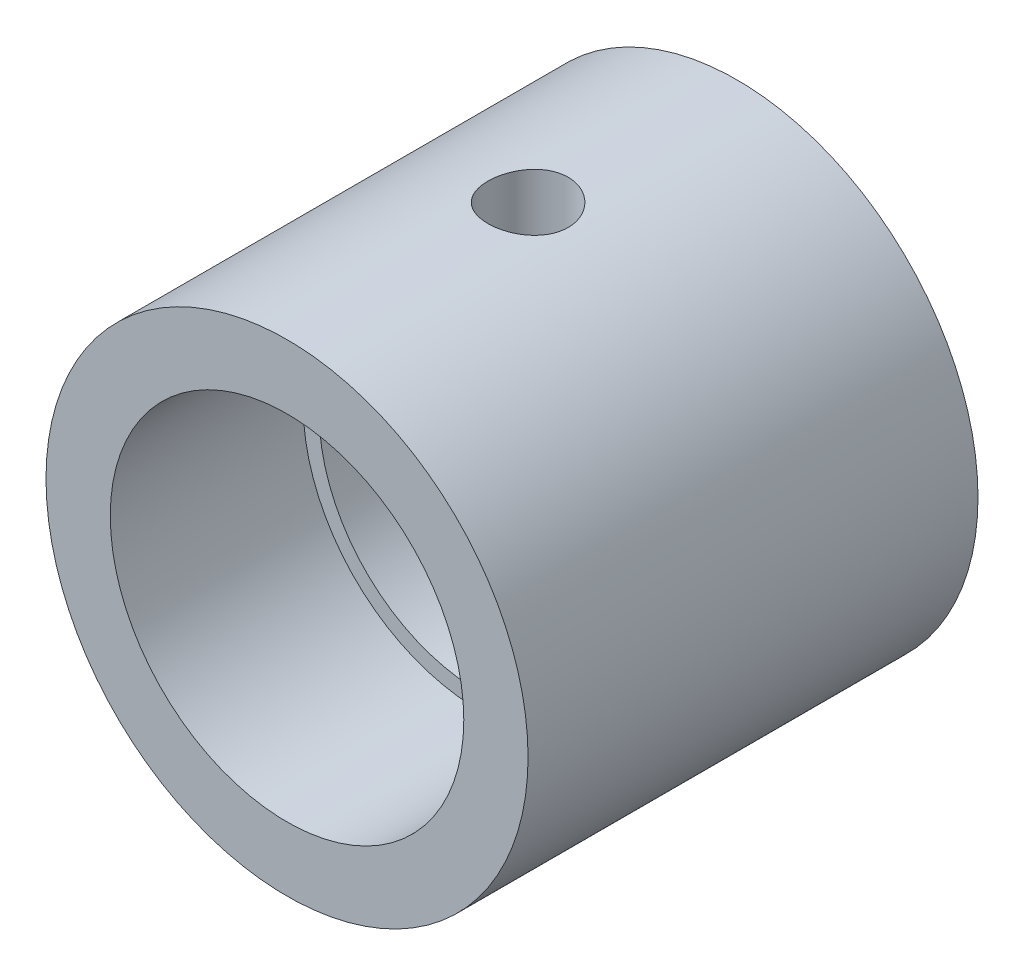
ISO-10303-21;
HEADER;
FILE_DESCRIPTION(('STEP AP214'),'2;1');
FILE_NAME('part.step','',(''),(''),'','','');
FILE_SCHEMA(('AUTOMOTIVE_DESIGN { 1 0 10303 214 1 1 1 1 }'));
ENDSEC;
DATA;
#1=APPLICATION_CONTEXT('core data for automotive mechanical design processes');
#2=APPLICATION_PROTOCOL_DEFINITION('international standard','automotive_design',2000,#1);
#3=PRODUCT_CONTEXT('',#1,'mechanical');
#4=PRODUCT('Part','Part','',(#3));
#5=PRODUCT_RELATED_PRODUCT_CATEGORY('part','',(#4));
#6=PRODUCT_DEFINITION_FORMATION('','',#4);
#7=PRODUCT_DEFINITION_CONTEXT('part definition',#1,'design');
#8=PRODUCT_DEFINITION('design','',#6,#7);
#9=PRODUCT_DEFINITION_SHAPE('','',#8);
#10=(LENGTH_UNIT() NAMED_UNIT(*) SI_UNIT(.MILLI.,.METRE.));
#11=(NAMED_UNIT(*) PLANE_ANGLE_UNIT() SI_UNIT($,.RADIAN.));
#12=(NAMED_UNIT(*) SI_UNIT($,.STERADIAN.) SOLID_ANGLE_UNIT());
#13=UNCERTAINTY_MEASURE_WITH_UNIT(LENGTH_MEASURE(1.E-05),#10,'distance_accuracy_value','');
#14=(GEOMETRIC_REPRESENTATION_CONTEXT(3) GLOBAL_UNCERTAINTY_ASSIGNED_CONTEXT((#13)) GLOBAL_UNIT_ASSIGNED_CONTEXT((#10,
#11,#12)) REPRESENTATION_CONTEXT('',''));
#15=CARTESIAN_POINT('',(0.,0.,0.));
#16=DIRECTION('',(0.,0.,1.));
#17=DIRECTION('',(1.,0.,0.));
#18=AXIS2_PLACEMENT_3D('',#15,#16,#17);
#19=CARTESIAN_POINT('',(0.,0.,27.));
#20=DIRECTION('',(0.,0.,-1.));
#21=DIRECTION('',(-1.,0.,0.));
#22=AXIS2_PLACEMENT_3D('',#19,#20,#21);
#23=CYLINDRICAL_SURFACE('',#22,15.);
#24=CARTESIAN_POINT('',(0.,-15.,14.5));
#25=CARTESIAN_POINT('',(0.139390904958215,-14.9999976116882,14.4999944110522));
#26=CARTESIAN_POINT('',(0.278857881838821,-14.9980367791303,14.4883027250311));
#27=CARTESIAN_POINT('',(0.553880221673043,-14.9904034494139,14.4418643412347));
#28=CARTESIAN_POINT('',(0.689431867959247,-14.9847275392389,14.4070964430884));
#29=CARTESIAN_POINT('',(0.952604747212645,-14.9703006823645,14.3155845514072));
#30=CARTESIAN_POINT('',(1.0802323684319,-14.9615522515919,14.2588585343594));
#31=CARTESIAN_POINT('',(1.32414184197795,-14.9419422708207,14.1250877079476));
#32=CARTESIAN_POINT('',(1.44042498987859,-14.9310809625443,14.048045222517));
#33=CARTESIAN_POINT('',(1.65947261429168,-14.9083331745831,13.8750449161795));
#34=CARTESIAN_POINT('',(1.76211290353497,-14.8964387181486,13.7789308853639));
#35=CARTESIAN_POINT('',(1.94988849865993,-14.8730262687673,13.5708520315272));
#36=CARTESIAN_POINT('',(2.03502269939097,-14.8615082996267,13.4588862085434));
#37=CARTESIAN_POINT('',(2.18586712560514,-14.8400756575978,13.2214290338029));
#38=CARTESIAN_POINT('',(2.251454552861,-14.8301712909164,13.0958586631952));
#39=CARTESIAN_POINT('',(2.36055836541122,-14.8131978979467,12.8352904356994));
#40=CARTESIAN_POINT('',(2.40407624156561,-14.8061286801431,12.7002932163224));
#41=CARTESIAN_POINT('',(2.46741437778481,-14.7957053684276,12.4260197251435));
#42=CARTESIAN_POINT('',(2.4874490291354,-14.792317684857,12.2867942634986));
#43=CARTESIAN_POINT('',(2.50391672528988,-14.7895393893665,12.0069197231165));
#44=CARTESIAN_POINT('',(2.500351440389,-14.7901484945721,11.8662707458327));
#45=CARTESIAN_POINT('',(2.46989509839615,-14.7952642886355,11.5890721387245));
#46=CARTESIAN_POINT('',(2.44324488188977,-14.7997307331892,11.4524951964548));
#47=CARTESIAN_POINT('',(2.36775314040345,-14.8119949521101,11.1857786821709));
#48=CARTESIAN_POINT('',(2.31891085431974,-14.8197928407327,11.0556393311115));
#49=CARTESIAN_POINT('',(2.20017724609391,-14.837884793341,10.8047711765591));
#50=CARTESIAN_POINT('',(2.13018591387971,-14.8481906710733,10.6840905939188));
#51=CARTESIAN_POINT('',(1.97121201755743,-14.8701291841501,10.4560955994616));
#52=CARTESIAN_POINT('',(1.88222792065429,-14.8817619265429,10.3487822675451));
#53=CARTESIAN_POINT('',(1.68648221215905,-14.9052202787979,10.1491739141927));
#54=CARTESIAN_POINT('',(1.57951396387313,-14.9170464923165,10.0570814814599));
#55=CARTESIAN_POINT('',(1.35153524898165,-14.9394260139672,9.89212223733466));
#56=CARTESIAN_POINT('',(1.23052469190642,-14.9499793138975,9.81925554981677));
#57=CARTESIAN_POINT('',(0.977705916166711,-14.9686389289291,9.69479777286372));
#58=CARTESIAN_POINT('',(0.845888725564662,-14.9767431840745,9.64322458066874));
#59=CARTESIAN_POINT('',(0.575298345602731,-14.9895750301266,9.56300578475402));
#60=CARTESIAN_POINT('',(0.436525739179468,-14.9943029035047,9.53435826302628));
#61=CARTESIAN_POINT('',(0.157709901301623,-14.9998112984269,9.50107864153886));
#62=CARTESIAN_POINT('',(0.0177007371510107,-15.0006375301278,9.49616842819439));
#63=CARTESIAN_POINT('',(-0.261139772889888,-14.9983747442117,9.50976134442812));
#64=CARTESIAN_POINT('',(-0.399971163892039,-14.9952858772412,9.52826357313374));
#65=CARTESIAN_POINT('',(-0.671656175546764,-14.985568269382,9.58792484933548));
#66=CARTESIAN_POINT('',(-0.804540868385379,-14.9789610480131,9.62894620839012));
#67=CARTESIAN_POINT('',(-1.06154688486044,-14.9629446445536,9.73233451819953));
#68=CARTESIAN_POINT('',(-1.18566771590972,-14.9535353051202,9.79470266763527));
#69=CARTESIAN_POINT('',(-1.42283068946896,-14.9328451630241,9.93965112469679));
#70=CARTESIAN_POINT('',(-1.53576525093715,-14.9215485588702,10.0224051561673));
#71=CARTESIAN_POINT('',(-1.74624358550269,-14.898384673919,10.2055373153851));
#72=CARTESIAN_POINT('',(-1.84378623969658,-14.8865173517155,10.3059167232767));
#73=CARTESIAN_POINT('',(-2.021742779658,-14.8634017523585,10.5226975480714));
#74=CARTESIAN_POINT('',(-2.10196876111372,-14.8521611613711,10.6392541655144));
#75=CARTESIAN_POINT('',(-2.24170231029499,-14.8317152977788,10.8843529691385));
#76=CARTESIAN_POINT('',(-2.30121053476982,-14.8225099606602,11.0128947752275));
#77=CARTESIAN_POINT('',(-2.39753833147315,-14.807234536977,11.2777897328121));
#78=CARTESIAN_POINT('',(-2.43445143254795,-14.8011515431106,11.4141080950305));
#79=CARTESIAN_POINT('',(-2.48483545377828,-14.7927771683526,11.6911201292218));
#80=CARTESIAN_POINT('',(-2.49830841194617,-14.7904854578272,11.8318134197321));
#81=CARTESIAN_POINT('',(-2.50137286604735,-14.7899673308401,12.1117051659624));
#82=CARTESIAN_POINT('',(-2.49126013612519,-14.7916905650565,12.2509003785753));
#83=CARTESIAN_POINT('',(-2.44807983895685,-14.7988978145373,12.5255792480508));
#84=CARTESIAN_POINT('',(-2.41501234611248,-14.8043818176121,12.6610629169419));
#85=CARTESIAN_POINT('',(-2.3269744895949,-14.8184735628172,12.9243584372926));
#86=CARTESIAN_POINT('',(-2.27202959060044,-14.8270776721967,13.052179010056));
#87=CARTESIAN_POINT('',(-2.14182700391591,-14.8464436892221,13.2968356691948));
#88=CARTESIAN_POINT('',(-2.06656830874856,-14.857205703884,13.4136712103721));
#89=CARTESIAN_POINT('',(-1.89681888437216,-14.8798345404562,13.6345355831078));
#90=CARTESIAN_POINT('',(-1.80211056359365,-14.891712955763,13.7383960167003));
#91=CARTESIAN_POINT('',(-1.59660903138023,-14.9151437236084,13.9288516044749));
#92=CARTESIAN_POINT('',(-1.48581211291264,-14.9266960002655,14.0154427686382));
#93=CARTESIAN_POINT('',(-1.25036916964028,-14.9482652964222,14.1694482681999));
#94=CARTESIAN_POINT('',(-1.12563278753282,-14.958271162531,14.236726039313));
#95=CARTESIAN_POINT('',(-0.866513069378981,-14.9755116760178,14.3492694846099));
#96=CARTESIAN_POINT('',(-0.73213949483001,-14.9827490817748,14.3945570810797));
#97=CARTESIAN_POINT('',(-0.4977033100454,-14.9920579083296,14.4520052741267));
#98=CARTESIAN_POINT('',(-0.399058830298447,-14.9950202727336,14.469974469616));
#99=CARTESIAN_POINT('',(-0.200289310319809,-14.9989921598612,14.4939737378448));
#100=CARTESIAN_POINT('',(-0.100164295608494,-15.0000017162064,14.5000040161374));
#101=CARTESIAN_POINT('',(0.,-15.,14.5));
#102=B_SPLINE_CURVE_WITH_KNOTS('',3,(#24,#25,#26,#27,#28,#29,#30,#31,#32,#33,#34,#35,#36,#37,
#38,#39,#40,#41,#42,#43,#44,#45,#46,#47,#48,#49,#50,#51,#52,#53,#54,#55,#56,#57,#58,#59,#60,#61,
#62,#63,#64,#65,#66,#67,#68,#69,#70,#71,#72,#73,#74,#75,#76,#77,#78,#79,#80,#81,#82,#83,#84,#85,
#86,#87,#88,#89,#90,#91,#92,#93,#94,#95,#96,#97,#98,#99,#100,#101),.UNSPECIFIED.,.T.,.F.,(4,2,2,
2,2,2,2,2,2,2,2,2,2,2,2,2,2,2,2,2,2,2,2,2,2,2,2,2,2,2,2,2,2,2,2,2,2,2,4),(0.,0.41780658493851,
0.835997545695421,1.25384686702527,1.67164841267479,2.09302491062332,2.51442800169857,
2.9384252082384,3.36239376876182,3.78246077103424,4.20249804320887,4.61820521760409,
5.03392665025382,5.45164556632558,5.86939820680574,6.29232769911327,6.71525991635848,
7.13854688915904,7.56179844521149,7.98007883491398,8.3983431303586,8.81407807006416,
9.22983635826067,9.64926825627024,10.0687306305428,10.4925382200762,10.9163323737594,
11.3383602234177,11.7603513778662,12.177079095227,12.5938054618813,13.0100481822622,
13.4263115502934,13.8475138419339,14.2688133387897,14.693022316072,15.1168075213007,
15.4170424816402,15.7172722727697),.UNSPECIFIED.);
#103=CARTESIAN_POINT('',(0.,-15.,14.5));
#104=VERTEX_POINT('',#103);
#105=EDGE_CURVE('E88',#104,#104,#102,.T.);
#106=ORIENTED_EDGE('',*,*,#105,.T.);
#107=EDGE_LOOP('',(#106));
#108=FACE_BOUND('',#107,.T.);
#109=CARTESIAN_POINT('',(0.,15.,14.5));
#110=CARTESIAN_POINT('',(-0.139390904958215,14.9999976116882,14.4999944110522));
#111=CARTESIAN_POINT('',(-0.278857881838821,14.9980367791303,14.4883027250311));
#112=CARTESIAN_POINT('',(-0.553880221673043,14.9904034494139,14.4418643412347));
#113=CARTESIAN_POINT('',(-0.689431867959248,14.9847275392389,14.4070964430884));
#114=CARTESIAN_POINT('',(-0.952604747212645,14.9703006823645,14.3155845514072));
#115=CARTESIAN_POINT('',(-1.0802323684319,14.9615522515919,14.2588585343594));
#116=CARTESIAN_POINT('',(-1.32414184197795,14.9419422708207,14.1250877079476));
#117=CARTESIAN_POINT('',(-1.44042498987859,14.9310809625443,14.048045222517));
#118=CARTESIAN_POINT('',(-1.65947261429168,14.9083331745831,13.8750449161795));
#119=CARTESIAN_POINT('',(-1.76211290353497,14.8964387181486,13.7789308853639));
#120=CARTESIAN_POINT('',(-1.94988849865993,14.8730262687673,13.5708520315272));
#121=CARTESIAN_POINT('',(-2.03502269939097,14.8615082996267,13.4588862085434));
#122=CARTESIAN_POINT('',(-2.18586712560514,14.8400756575978,13.2214290338029));
#123=CARTESIAN_POINT('',(-2.251454552861,14.8301712909164,13.0958586631952));
#124=CARTESIAN_POINT('',(-2.36055836541122,14.8131978979467,12.8352904356994));
#125=CARTESIAN_POINT('',(-2.40407624156561,14.8061286801431,12.7002932163224));
#126=CARTESIAN_POINT('',(-2.46741437778481,14.7957053684276,12.4260197251435));
#127=CARTESIAN_POINT('',(-2.4874490291354,14.792317684857,12.2867942634986));
#128=CARTESIAN_POINT('',(-2.50391672528988,14.7895393893665,12.0069197231165));
#129=CARTESIAN_POINT('',(-2.500351440389,14.7901484945721,11.8662707458327));
#130=CARTESIAN_POINT('',(-2.46989509839615,14.7952642886355,11.5890721387245));
#131=CARTESIAN_POINT('',(-2.44324488188977,14.7997307331892,11.4524951964548));
#132=CARTESIAN_POINT('',(-2.36775314040345,14.8119949521101,11.1857786821709));
#133=CARTESIAN_POINT('',(-2.31891085431974,14.8197928407327,11.0556393311115));
#134=CARTESIAN_POINT('',(-2.20017724609391,14.837884793341,10.8047711765591));
#135=CARTESIAN_POINT('',(-2.13018591387971,14.8481906710733,10.6840905939188));
#136=CARTESIAN_POINT('',(-1.97121201755743,14.8701291841501,10.4560955994616));
#137=CARTESIAN_POINT('',(-1.88222792065429,14.8817619265429,10.3487822675451));
#138=CARTESIAN_POINT('',(-1.68648221215905,14.9052202787979,10.1491739141927));
#139=CARTESIAN_POINT('',(-1.57951396387313,14.9170464923165,10.0570814814599));
#140=CARTESIAN_POINT('',(-1.35153524898165,14.9394260139672,9.89212223733466));
#141=CARTESIAN_POINT('',(-1.23052469190642,14.9499793138975,9.81925554981677));
#142=CARTESIAN_POINT('',(-0.977705916166712,14.9686389289291,9.69479777286372));
#143=CARTESIAN_POINT('',(-0.845888725564662,14.9767431840745,9.64322458066874));
#144=CARTESIAN_POINT('',(-0.575298345602732,14.9895750301266,9.56300578475402));
#145=CARTESIAN_POINT('',(-0.436525739179468,14.9943029035047,9.53435826302628));
#146=CARTESIAN_POINT('',(-0.157709901301623,14.9998112984269,9.50107864153886));
#147=CARTESIAN_POINT('',(-0.0177007371510108,15.0006375301278,9.49616842819439));
#148=CARTESIAN_POINT('',(0.261139772889888,14.9983747442117,9.50976134442812));
#149=CARTESIAN_POINT('',(0.399971163892039,14.9952858772412,9.52826357313374));
#150=CARTESIAN_POINT('',(0.671656175546764,14.985568269382,9.58792484933548));
#151=CARTESIAN_POINT('',(0.80454086838538,14.9789610480131,9.62894620839012));
#152=CARTESIAN_POINT('',(1.06154688486044,14.9629446445536,9.73233451819953));
#153=CARTESIAN_POINT('',(1.18566771590972,14.9535353051202,9.79470266763527));
#154=CARTESIAN_POINT('',(1.42283068946896,14.9328451630241,9.93965112469679));
#155=CARTESIAN_POINT('',(1.53576525093715,14.9215485588702,10.0224051561673));
#156=CARTESIAN_POINT('',(1.74624358550269,14.898384673919,10.2055373153851));
#157=CARTESIAN_POINT('',(1.84378623969658,14.8865173517155,10.3059167232767));
#158=CARTESIAN_POINT('',(2.021742779658,14.8634017523585,10.5226975480714));
#159=CARTESIAN_POINT('',(2.10196876111372,14.8521611613711,10.6392541655144));
#160=CARTESIAN_POINT('',(2.24170231029499,14.8317152977788,10.8843529691385));
#161=CARTESIAN_POINT('',(2.30121053476982,14.8225099606602,11.0128947752275));
#162=CARTESIAN_POINT('',(2.39753833147315,14.807234536977,11.2777897328121));
#163=CARTESIAN_POINT('',(2.43445143254795,14.8011515431106,11.4141080950305));
#164=CARTESIAN_POINT('',(2.48483545377828,14.7927771683526,11.6911201292218));
#165=CARTESIAN_POINT('',(2.49830841194617,14.7904854578272,11.8318134197321));
#166=CARTESIAN_POINT('',(2.50137286604735,14.7899673308401,12.1117051659624));
#167=CARTESIAN_POINT('',(2.49126013612519,14.7916905650565,12.2509003785753));
#168=CARTESIAN_POINT('',(2.44807983895685,14.7988978145373,12.5255792480508));
#169=CARTESIAN_POINT('',(2.41501234611248,14.8043818176121,12.6610629169419));
#170=CARTESIAN_POINT('',(2.3269744895949,14.8184735628172,12.9243584372926));
#171=CARTESIAN_POINT('',(2.27202959060044,14.8270776721967,13.052179010056));
#172=CARTESIAN_POINT('',(2.14182700391591,14.8464436892221,13.2968356691948));
#173=CARTESIAN_POINT('',(2.06656830874856,14.857205703884,13.4136712103721));
#174=CARTESIAN_POINT('',(1.89681888437216,14.8798345404562,13.6345355831078));
#175=CARTESIAN_POINT('',(1.80211056359365,14.891712955763,13.7383960167003));
#176=CARTESIAN_POINT('',(1.59660903138023,14.9151437236084,13.9288516044749));
#177=CARTESIAN_POINT('',(1.48581211291264,14.9266960002655,14.0154427686382));
#178=CARTESIAN_POINT('',(1.25036916964028,14.9482652964222,14.1694482681999));
#179=CARTESIAN_POINT('',(1.12563278753282,14.958271162531,14.236726039313));
#180=CARTESIAN_POINT('',(0.866513069378982,14.9755116760178,14.3492694846099));
#181=CARTESIAN_POINT('',(0.73213949483001,14.9827490817748,14.3945570810797));
#182=CARTESIAN_POINT('',(0.497703310045401,14.9920579083296,14.4520052741267));
#183=CARTESIAN_POINT('',(0.399058830298448,14.9950202727336,14.469974469616));
#184=CARTESIAN_POINT('',(0.200289310319809,14.9989921598612,14.4939737378448));
#185=CARTESIAN_POINT('',(0.100164295608494,15.0000017162064,14.5000040161374));
#186=CARTESIAN_POINT('',(0.,15.,14.5));
#187=B_SPLINE_CURVE_WITH_KNOTS('',3,(#109,#110,#111,#112,#113,#114,#115,#116,#117,#118,#119,
#120,#121,#122,#123,#124,#125,#126,#127,#128,#129,#130,#131,#132,#133,#134,#135,#136,#137,#138,
#139,#140,#141,#142,#143,#144,#145,#146,#147,#148,#149,#150,#151,#152,#153,#154,#155,#156,#157,
#158,#159,#160,#161,#162,#163,#164,#165,#166,#167,#168,#169,#170,#171,#172,#173,#174,#175,#176,
#177,#178,#179,#180,#181,#182,#183,#184,#185,#186),.UNSPECIFIED.,.T.,.F.,(4,2,2,2,2,2,2,2,2,2,2,
2,2,2,2,2,2,2,2,2,2,2,2,2,2,2,2,2,2,2,2,2,2,2,2,2,2,2,4),(0.,0.41780658493851,0.835997545695422,
1.25384686702527,1.67164841267479,2.09302491062332,2.51442800169857,2.9384252082384,
3.36239376876182,3.78246077103424,4.20249804320887,4.61820521760409,5.03392665025382,
5.45164556632558,5.86939820680574,6.29232769911327,6.71525991635848,7.13854688915904,
7.56179844521149,7.98007883491398,8.3983431303586,8.81407807006416,9.22983635826067,
9.64926825627025,10.0687306305428,10.4925382200762,10.9163323737594,11.3383602234177,
11.7603513778662,12.177079095227,12.5938054618813,13.0100481822622,13.4263115502934,
13.8475138419339,14.2688133387897,14.693022316072,15.1168075213007,15.4170424816402,
15.7172722727697),.UNSPECIFIED.);
#188=CARTESIAN_POINT('',(0.,15.,14.5));
#189=VERTEX_POINT('',#188);
#190=EDGE_CURVE('E82',#189,#189,#187,.T.);
#191=ORIENTED_EDGE('',*,*,#190,.T.);
#192=EDGE_LOOP('',(#191));
#193=FACE_BOUND('',#192,.T.);
#194=CARTESIAN_POINT('',(0.,0.,27.));
#195=DIRECTION('',(0.,0.,1.));
#196=DIRECTION('',(1.,0.,0.));
#197=AXIS2_PLACEMENT_3D('',#194,#195,#196);
#198=CIRCLE('',#197,15.);
#199=CARTESIAN_POINT('',(15.,0.,27.));
#200=VERTEX_POINT('',#199);
#201=EDGE_CURVE('E10',#200,#200,#198,.T.);
#202=ORIENTED_EDGE('',*,*,#201,.F.);
#203=EDGE_LOOP('',(#202));
#204=FACE_BOUND('',#203,.T.);
#205=CARTESIAN_POINT('',(0.,0.,-1.));
#206=DIRECTION('',(0.,0.,-1.));
#207=DIRECTION('',(-1.,0.,0.));
#208=AXIS2_PLACEMENT_3D('',#205,#206,#207);
#209=CIRCLE('',#208,15.);
#210=CARTESIAN_POINT('',(-15.,0.,-1.));
#211=VERTEX_POINT('',#210);
#212=EDGE_CURVE('E95',#211,#211,#209,.T.);
#213=ORIENTED_EDGE('',*,*,#212,.F.);
#214=EDGE_LOOP('',(#213));
#215=FACE_BOUND('',#214,.T.);
#216=ADVANCED_FACE('F37',(#108,#193,#204,#215),#23,.T.);
#217=CARTESIAN_POINT('',(0.,0.,27.));
#218=DIRECTION('',(0.,0.,1.));
#219=DIRECTION('',(1.,0.,0.));
#220=AXIS2_PLACEMENT_3D('',#217,#218,#219);
#221=PLANE('',#220);
#222=CARTESIAN_POINT('',(0.,0.,27.));
#223=DIRECTION('',(0.,0.,1.));
#224=DIRECTION('',(1.,0.,0.));
#225=AXIS2_PLACEMENT_3D('',#222,#223,#224);
#226=CIRCLE('',#225,11.);
#227=CARTESIAN_POINT('',(11.,0.,27.));
#228=VERTEX_POINT('',#227);
#229=EDGE_CURVE('E99',#228,#228,#226,.T.);
#230=ORIENTED_EDGE('',*,*,#229,.F.);
#231=EDGE_LOOP('',(#230));
#232=FACE_BOUND('',#231,.T.);
#233=ORIENTED_EDGE('',*,*,#201,.T.);
#234=EDGE_LOOP('',(#233));
#235=FACE_BOUND('',#234,.T.);
#236=ADVANCED_FACE('F123',(#232,#235),#221,.T.);
#237=CARTESIAN_POINT('',(0.,0.,27.));
#238=DIRECTION('',(0.,0.,1.));
#239=DIRECTION('',(1.,0.,0.));
#240=AXIS2_PLACEMENT_3D('',#237,#238,#239);
#241=CYLINDRICAL_SURFACE('',#240,9.99999999999999);
#242=CARTESIAN_POINT('',(0.,-9.99999999999999,14.5));
#243=CARTESIAN_POINT('',(-0.138126814449552,-9.99999766446687,14.4999961237697));
#244=CARTESIAN_POINT('',(-0.276296929717939,-9.99710963553043,14.4885140820437));
#245=CARTESIAN_POINT('',(-0.548677206284221,-9.98586856383157,14.442958081155));
#246=CARTESIAN_POINT('',(-0.682885078117899,-9.97751242366626,14.4088713174369));
#247=CARTESIAN_POINT('',(-0.943368120304295,-9.9562604388672,14.3192679108965));
#248=CARTESIAN_POINT('',(-1.06965260571667,-9.94337004736763,14.2637770021412));
#249=CARTESIAN_POINT('',(-1.31112021984071,-9.91442239679368,14.1330310165919));
#250=CARTESIAN_POINT('',(-1.4263029739146,-9.8983650309026,14.0577752731351));
#251=CARTESIAN_POINT('',(-1.64466987883486,-9.86445689319488,13.8879986839097));
#252=CARTESIAN_POINT('',(-1.74759281676843,-9.84657845246876,13.7931473750682));
#253=CARTESIAN_POINT('',(-1.93624821200553,-9.8112270019656,13.5875796584849));
#254=CARTESIAN_POINT('',(-2.02197872824865,-9.79375403816446,13.4768614617551));
#255=CARTESIAN_POINT('',(-2.17504423799829,-9.7609129283028,13.240674622105));
#256=CARTESIAN_POINT('',(-2.2420870265419,-9.74557990774684,13.1150112819855));
#257=CARTESIAN_POINT('',(-2.35399484758457,-9.71915824696693,12.8537526472333));
#258=CARTESIAN_POINT('',(-2.39886342573357,-9.7080689282403,12.7181589444466));
#259=CARTESIAN_POINT('',(-2.46425806134128,-9.69167461160538,12.4437608363306));
#260=CARTESIAN_POINT('',(-2.48525378055342,-9.68625818328351,12.30507517327));
#261=CARTESIAN_POINT('',(-2.50376962511068,-9.68148937432652,12.0260523850011));
#262=CARTESIAN_POINT('',(-2.50129356969685,-9.68213600713214,11.8857155321798));
#263=CARTESIAN_POINT('',(-2.47331087439951,-9.68932009194694,11.6109736537577));
#264=CARTESIAN_POINT('',(-2.44836390031772,-9.69571438345489,11.4765072975578));
#265=CARTESIAN_POINT('',(-2.37704031150499,-9.71344516118448,11.2137315818149));
#266=CARTESIAN_POINT('',(-2.33066217011566,-9.72478199948731,11.0854226616185));
#267=CARTESIAN_POINT('',(-2.21731579656198,-9.75125189842764,10.8371033062465));
#268=CARTESIAN_POINT('',(-2.1501444453882,-9.76642212449693,10.717189713684));
#269=CARTESIAN_POINT('',(-1.99726046002491,-9.79882851409984,10.4901354837386));
#270=CARTESIAN_POINT('',(-1.91154458134806,-9.81606503891046,10.3829970865546));
#271=CARTESIAN_POINT('',(-1.72110570780204,-9.85126467566485,10.181327307176));
#272=CARTESIAN_POINT('',(-1.61591043027644,-9.86923449130001,10.0872425165644));
#273=CARTESIAN_POINT('',(-1.39101986250617,-9.90343275964593,9.91796459589349));
#274=CARTESIAN_POINT('',(-1.27132412951324,-9.91966115915679,9.84277204289406));
#275=CARTESIAN_POINT('',(-1.02019314780232,-9.9486288682365,9.71324902295936));
#276=CARTESIAN_POINT('',(-0.888718988681039,-9.96135600212878,9.65899109957595));
#277=CARTESIAN_POINT('',(-0.618126680238139,-9.9817986165236,9.57347115715071));
#278=CARTESIAN_POINT('',(-0.479009998584142,-9.98951505565467,9.5422047393031));
#279=CARTESIAN_POINT('',(-0.200899950650047,-9.99892498785624,9.50423739073527));
#280=CARTESIAN_POINT('',(-0.0619945333136854,-10.0007675584713,9.4969282898745));
#281=CARTESIAN_POINT('',(0.215054791335846,-9.99864674690754,9.50541500342581));
#282=CARTESIAN_POINT('',(0.353198766074326,-9.99468388736421,9.52120873799856));
#283=CARTESIAN_POINT('',(0.622690447960817,-9.98149301878918,9.57495151398562));
#284=CARTESIAN_POINT('',(0.754108531614582,-9.97234390309646,9.61256877246162));
#285=CARTESIAN_POINT('',(1.00876215408753,-9.94981177723595,9.7085118067141));
#286=CARTESIAN_POINT('',(1.13199686505442,-9.93642833949964,9.76683967385537));
#287=CARTESIAN_POINT('',(1.36920522404972,-9.9065551321037,9.90372688145779));
#288=CARTESIAN_POINT('',(1.48297573639294,-9.89001445610999,9.98262685399427));
#289=CARTESIAN_POINT('',(1.69587768940552,-9.85574181979586,10.1579831813286));
#290=CARTESIAN_POINT('',(1.79500659828875,-9.83800965421577,10.2544425660294));
#291=CARTESIAN_POINT('',(1.97831761345414,-9.80281594932497,10.4650032680728));
#292=CARTESIAN_POINT('',(2.06207311270184,-9.78537173637463,10.5794795049993));
#293=CARTESIAN_POINT('',(2.20918459835605,-9.75321463970069,10.8212210574476));
#294=CARTESIAN_POINT('',(2.27254149026901,-9.7385016347494,10.9484858049507));
#295=CARTESIAN_POINT('',(2.37658570101223,-9.71363491194664,11.2115095373437));
#296=CARTESIAN_POINT('',(2.41740732773931,-9.70345425375808,11.3472127138538));
#297=CARTESIAN_POINT('',(2.47557609990489,-9.68877906706585,11.6238493964255));
#298=CARTESIAN_POINT('',(2.49292837912652,-9.68428329504044,11.7647817517024));
#299=CARTESIAN_POINT('',(2.50339765056083,-9.68158168701612,12.0435350397693));
#300=CARTESIAN_POINT('',(2.49719649630132,-9.68319887888034,12.1813290585441));
#301=CARTESIAN_POINT('',(2.46229546385366,-9.69213181672142,12.4538398144438));
#302=CARTESIAN_POINT('',(2.43359603781098,-9.69944744817731,12.5885566133553));
#303=CARTESIAN_POINT('',(2.35488553240495,-9.71885434473221,12.8503474317764));
#304=CARTESIAN_POINT('',(2.30500234113404,-9.73091692061056,12.9774621754006));
#305=CARTESIAN_POINT('',(2.18544152267504,-9.75846259540839,13.2216089711893));
#306=CARTESIAN_POINT('',(2.11576115005696,-9.77394616867808,13.3386396219781));
#307=CARTESIAN_POINT('',(1.95644624772858,-9.80709390439337,13.5625910483368));
#308=CARTESIAN_POINT('',(1.86633860485376,-9.82480441386302,13.6691684557066));
#309=CARTESIAN_POINT('',(1.66964895198289,-9.86013378743769,13.8659117413257));
#310=CARTESIAN_POINT('',(1.56306303543524,-9.87775262878421,13.9560737168549));
#311=CARTESIAN_POINT('',(1.33411264450432,-9.91129426079449,14.1190188476077));
#312=CARTESIAN_POINT('',(1.21149737052731,-9.92718055609783,14.1914576894526));
#313=CARTESIAN_POINT('',(0.955443432517461,-9.9550820829186,14.3145791049009));
#314=CARTESIAN_POINT('',(0.822012605727901,-9.96710008666301,14.3652772677476));
#315=CARTESIAN_POINT('',(0.574017088739121,-9.98413432609236,14.4359530505494));
#316=CARTESIAN_POINT('',(0.460633618180116,-9.99004308421151,14.4599187384224));
#317=CARTESIAN_POINT('',(0.231510119227139,-9.9979767538658,14.4919432393699));
#318=CARTESIAN_POINT('',(0.115770268737694,-10.0000019575149,14.5000032488422));
#319=CARTESIAN_POINT('',(0.,-9.99999999999999,14.5));
#320=B_SPLINE_CURVE_WITH_KNOTS('',3,(#242,#243,#244,#245,#246,#247,#248,#249,#250,#251,#252,
#253,#254,#255,#256,#257,#258,#259,#260,#261,#262,#263,#264,#265,#266,#267,#268,#269,#270,#271,
#272,#273,#274,#275,#276,#277,#278,#279,#280,#281,#282,#283,#284,#285,#286,#287,#288,#289,#290,
#291,#292,#293,#294,#295,#296,#297,#298,#299,#300,#301,#302,#303,#304,#305,#306,#307,#308,#309,
#310,#311,#312,#313,#314,#315,#316,#317,#318,#319),.UNSPECIFIED.,.T.,.F.,(4,2,2,2,2,2,2,2,2,2,2,
2,2,2,2,2,2,2,2,2,2,2,2,2,2,2,2,2,2,2,2,2,2,2,2,2,2,2,4),(0.,0.41395618745315,0.828147062939833,
1.24184150381018,1.65554990028221,2.07690725728565,2.4983121596677,2.92597745909678,
3.35357435282281,3.77260491835116,4.19156730193363,4.60037495017231,5.00921172448932,
5.42217546462,5.83521151399139,6.26002501620567,6.6848514926928,7.11113715020725,
7.53734122819939,7.95263848254328,8.36789835193439,8.7770045752893,9.18615212209352,
9.60255979281122,10.0190393835223,10.44574182013,10.8724253125472,11.2965375769764,
11.7205570543048,12.1323963400749,12.5442273493652,12.9536066760888,13.3630428023797,
13.7831596069298,14.2033761629383,14.6312030917578,15.0587227304538,15.4057040491338,
15.752659267482),.UNSPECIFIED.);
#321=CARTESIAN_POINT('',(0.,-9.99999999999999,14.5));
#322=VERTEX_POINT('',#321);
#323=EDGE_CURVE('E41',#322,#322,#320,.T.);
#324=ORIENTED_EDGE('',*,*,#323,.T.);
#325=EDGE_LOOP('',(#324));
#326=FACE_BOUND('',#325,.T.);
#327=CARTESIAN_POINT('',(0.,9.99999999999999,14.5));
#328=CARTESIAN_POINT('',(0.138126814449552,9.99999766446687,14.4999961237697));
#329=CARTESIAN_POINT('',(0.276296929717939,9.99710963553043,14.4885140820437));
#330=CARTESIAN_POINT('',(0.548677206284222,9.98586856383157,14.442958081155));
#331=CARTESIAN_POINT('',(0.6828850781179,9.97751242366626,14.4088713174369));
#332=CARTESIAN_POINT('',(0.943368120304296,9.9562604388672,14.3192679108965));
#333=CARTESIAN_POINT('',(1.06965260571667,9.94337004736763,14.2637770021412));
#334=CARTESIAN_POINT('',(1.31112021984071,9.91442239679368,14.1330310165919));
#335=CARTESIAN_POINT('',(1.42630297391461,9.8983650309026,14.0577752731351));
#336=CARTESIAN_POINT('',(1.64466987883486,9.86445689319488,13.8879986839097));
#337=CARTESIAN_POINT('',(1.74759281676843,9.84657845246876,13.7931473750682));
#338=CARTESIAN_POINT('',(1.93624821200553,9.8112270019656,13.5875796584849));
#339=CARTESIAN_POINT('',(2.02197872824865,9.79375403816445,13.4768614617551));
#340=CARTESIAN_POINT('',(2.17504423799829,9.7609129283028,13.240674622105));
#341=CARTESIAN_POINT('',(2.2420870265419,9.74557990774684,13.1150112819855));
#342=CARTESIAN_POINT('',(2.35399484758457,9.71915824696693,12.8537526472333));
#343=CARTESIAN_POINT('',(2.39886342573357,9.7080689282403,12.7181589444466));
#344=CARTESIAN_POINT('',(2.46425806134128,9.69167461160538,12.4437608363306));
#345=CARTESIAN_POINT('',(2.48525378055342,9.68625818328351,12.30507517327));
#346=CARTESIAN_POINT('',(2.50376962511068,9.68148937432652,12.0260523850011));
#347=CARTESIAN_POINT('',(2.50129356969685,9.68213600713214,11.8857155321798));
#348=CARTESIAN_POINT('',(2.47331087439951,9.68932009194694,11.6109736537577));
#349=CARTESIAN_POINT('',(2.44836390031772,9.69571438345489,11.4765072975578));
#350=CARTESIAN_POINT('',(2.37704031150499,9.71344516118448,11.2137315818149));
#351=CARTESIAN_POINT('',(2.33066217011566,9.72478199948731,11.0854226616185));
#352=CARTESIAN_POINT('',(2.21731579656197,9.75125189842764,10.8371033062464));
#353=CARTESIAN_POINT('',(2.1501444453882,9.76642212449693,10.717189713684));
#354=CARTESIAN_POINT('',(1.99726046002491,9.79882851409984,10.4901354837386));
#355=CARTESIAN_POINT('',(1.91154458134806,9.81606503891046,10.3829970865546));
#356=CARTESIAN_POINT('',(1.72110570780203,9.85126467566485,10.181327307176));
#357=CARTESIAN_POINT('',(1.61591043027643,9.86923449130001,10.0872425165644));
#358=CARTESIAN_POINT('',(1.39101986250617,9.90343275964593,9.91796459589349));
#359=CARTESIAN_POINT('',(1.27132412951324,9.91966115915679,9.84277204289406));
#360=CARTESIAN_POINT('',(1.02019314780232,9.9486288682365,9.71324902295936));
#361=CARTESIAN_POINT('',(0.888718988681039,9.96135600212878,9.65899109957595));
#362=CARTESIAN_POINT('',(0.618126680238138,9.9817986165236,9.57347115715071));
#363=CARTESIAN_POINT('',(0.479009998584141,9.98951505565467,9.5422047393031));
#364=CARTESIAN_POINT('',(0.200899950650044,9.99892498785624,9.50423739073527));
#365=CARTESIAN_POINT('',(0.0619945333136822,10.0007675584713,9.4969282898745));
#366=CARTESIAN_POINT('',(-0.215054791335849,9.99864674690754,9.50541500342581));
#367=CARTESIAN_POINT('',(-0.353198766074328,9.99468388736421,9.52120873799856));
#368=CARTESIAN_POINT('',(-0.622690447960819,9.98149301878918,9.57495151398563));
#369=CARTESIAN_POINT('',(-0.754108531614584,9.97234390309646,9.61256877246162));
#370=CARTESIAN_POINT('',(-1.00876215408753,9.94981177723595,9.7085118067141));
#371=CARTESIAN_POINT('',(-1.13199686505442,9.93642833949964,9.76683967385537));
#372=CARTESIAN_POINT('',(-1.36920522404972,9.9065551321037,9.90372688145779));
#373=CARTESIAN_POINT('',(-1.48297573639295,9.89001445610999,9.98262685399427));
#374=CARTESIAN_POINT('',(-1.69587768940552,9.85574181979586,10.1579831813286));
#375=CARTESIAN_POINT('',(-1.79500659828875,9.83800965421577,10.2544425660294));
#376=CARTESIAN_POINT('',(-1.97831761345414,9.80281594932497,10.4650032680728));
#377=CARTESIAN_POINT('',(-2.06207311270184,9.78537173637463,10.5794795049993));
#378=CARTESIAN_POINT('',(-2.20918459835605,9.75321463970069,10.8212210574476));
#379=CARTESIAN_POINT('',(-2.27254149026901,9.7385016347494,10.9484858049507));
#380=CARTESIAN_POINT('',(-2.37658570101223,9.71363491194664,11.2115095373437));
#381=CARTESIAN_POINT('',(-2.41740732773931,9.70345425375808,11.3472127138538));
#382=CARTESIAN_POINT('',(-2.47557609990489,9.68877906706585,11.6238493964255));
#383=CARTESIAN_POINT('',(-2.49292837912652,9.68428329504044,11.7647817517024));
#384=CARTESIAN_POINT('',(-2.50339765056083,9.68158168701612,12.0435350397693));
#385=CARTESIAN_POINT('',(-2.49719649630132,9.68319887888034,12.1813290585441));
#386=CARTESIAN_POINT('',(-2.46229546385366,9.69213181672142,12.4538398144438));
#387=CARTESIAN_POINT('',(-2.43359603781098,9.69944744817731,12.5885566133553));
#388=CARTESIAN_POINT('',(-2.35488553240495,9.71885434473221,12.8503474317764));
#389=CARTESIAN_POINT('',(-2.30500234113404,9.73091692061056,12.9774621754006));
#390=CARTESIAN_POINT('',(-2.18544152267504,9.75846259540839,13.2216089711893));
#391=CARTESIAN_POINT('',(-2.11576115005696,9.77394616867808,13.3386396219781));
#392=CARTESIAN_POINT('',(-1.95644624772858,9.80709390439337,13.5625910483368));
#393=CARTESIAN_POINT('',(-1.86633860485376,9.82480441386302,13.6691684557066));
#394=CARTESIAN_POINT('',(-1.66964895198289,9.86013378743769,13.8659117413257));
#395=CARTESIAN_POINT('',(-1.56306303543524,9.87775262878421,13.9560737168549));
#396=CARTESIAN_POINT('',(-1.33411264450432,9.91129426079449,14.1190188476077));
#397=CARTESIAN_POINT('',(-1.21149737052731,9.92718055609783,14.1914576894526));
#398=CARTESIAN_POINT('',(-0.955443432517461,9.95508208291861,14.3145791049009));
#399=CARTESIAN_POINT('',(-0.8220126057279,9.96710008666301,14.3652772677476));
#400=CARTESIAN_POINT('',(-0.57401708873912,9.98413432609236,14.4359530505494));
#401=CARTESIAN_POINT('',(-0.460633618180114,9.99004308421151,14.4599187384224));
#402=CARTESIAN_POINT('',(-0.231510119227139,9.9979767538658,14.4919432393699));
#403=CARTESIAN_POINT('',(-0.115770268737694,10.0000019575149,14.5000032488422));
#404=CARTESIAN_POINT('',(0.,9.99999999999999,14.5));
#405=B_SPLINE_CURVE_WITH_KNOTS('',3,(#327,#328,#329,#330,#331,#332,#333,#334,#335,#336,#337,
#338,#339,#340,#341,#342,#343,#344,#345,#346,#347,#348,#349,#350,#351,#352,#353,#354,#355,#356,
#357,#358,#359,#360,#361,#362,#363,#364,#365,#366,#367,#368,#369,#370,#371,#372,#373,#374,#375,
#376,#377,#378,#379,#380,#381,#382,#383,#384,#385,#386,#387,#388,#389,#390,#391,#392,#393,#394,
#395,#396,#397,#398,#399,#400,#401,#402,#403,#404),.UNSPECIFIED.,.T.,.F.,(4,2,2,2,2,2,2,2,2,2,2,
2,2,2,2,2,2,2,2,2,2,2,2,2,2,2,2,2,2,2,2,2,2,2,2,2,2,2,4),(0.,0.41395618745315,0.828147062939834,
1.24184150381018,1.65554990028222,2.07690725728565,2.4983121596677,2.92597745909678,
3.35357435282281,3.77260491835117,4.19156730193363,4.60037495017232,5.00921172448932,
5.42217546462,5.83521151399139,6.26002501620567,6.6848514926928,7.11113715020725,
7.5373412281994,7.95263848254329,8.3678983519344,8.77700457528931,9.18615212209353,
9.60255979281122,10.0190393835223,10.44574182013,10.8724253125472,11.2965375769764,
11.7205570543048,12.1323963400749,12.5442273493652,12.9536066760888,13.3630428023797,
13.7831596069298,14.2033761629383,14.6312030917578,15.0587227304538,15.4057040491338,
15.752659267482),.UNSPECIFIED.);
#406=CARTESIAN_POINT('',(0.,9.99999999999999,14.5));
#407=VERTEX_POINT('',#406);
#408=EDGE_CURVE('E60',#407,#407,#405,.T.);
#409=ORIENTED_EDGE('',*,*,#408,.T.);
#410=EDGE_LOOP('',(#409));
#411=FACE_BOUND('',#410,.T.);
#412=CARTESIAN_POINT('',(0.,0.,0.));
#413=DIRECTION('',(0.,0.,1.));
#414=DIRECTION('',(1.,0.,0.));
#415=AXIS2_PLACEMENT_3D('',#412,#413,#414);
#416=CIRCLE('',#415,9.99999999999999);
#417=CARTESIAN_POINT('',(9.99999999999999,0.,0.));
#418=VERTEX_POINT('',#417);
#419=EDGE_CURVE('E51',#418,#418,#416,.T.);
#420=ORIENTED_EDGE('',*,*,#419,.F.);
#421=EDGE_LOOP('',(#420));
#422=FACE_BOUND('',#421,.T.);
#423=CARTESIAN_POINT('',(0.,0.,15.));
#424=DIRECTION('',(0.,0.,1.));
#425=DIRECTION('',(1.,0.,0.));
#426=AXIS2_PLACEMENT_3D('',#423,#424,#425);
#427=CIRCLE('',#426,10.);
#428=CARTESIAN_POINT('',(10.,0.,15.));
#429=VERTEX_POINT('',#428);
#430=EDGE_CURVE('E57',#429,#429,#427,.T.);
#431=ORIENTED_EDGE('',*,*,#430,.T.);
#432=EDGE_LOOP('',(#431));
#433=FACE_BOUND('',#432,.T.);
#434=ADVANCED_FACE('F66',(#326,#411,#422,#433),#241,.F.);
#435=CARTESIAN_POINT('',(10.,0.,15.));
#436=DIRECTION('',(0.,0.,-1.));
#437=DIRECTION('',(-1.,0.,0.));
#438=AXIS2_PLACEMENT_3D('',#435,#436,#437);
#439=PLANE('',#438);
#440=ORIENTED_EDGE('',*,*,#430,.F.);
#441=EDGE_LOOP('',(#440));
#442=FACE_BOUND('',#441,.T.);
#443=CARTESIAN_POINT('',(0.,0.,15.));
#444=DIRECTION('',(0.,0.,1.));
#445=DIRECTION('',(1.,0.,0.));
#446=AXIS2_PLACEMENT_3D('',#443,#444,#445);
#447=CIRCLE('',#446,11.);
#448=CARTESIAN_POINT('',(11.,0.,15.));
#449=VERTEX_POINT('',#448);
#450=EDGE_CURVE('E103',#449,#449,#447,.T.);
#451=ORIENTED_EDGE('',*,*,#450,.T.);
#452=EDGE_LOOP('',(#451));
#453=FACE_BOUND('',#452,.T.);
#454=ADVANCED_FACE('F111',(#442,#453),#439,.F.);
#455=CARTESIAN_POINT('',(0.,0.,27.));
#456=DIRECTION('',(0.,0.,1.));
#457=DIRECTION('',(1.,0.,0.));
#458=AXIS2_PLACEMENT_3D('',#455,#456,#457);
#459=CYLINDRICAL_SURFACE('',#458,11.);
#460=ORIENTED_EDGE('',*,*,#450,.F.);
#461=EDGE_LOOP('',(#460));
#462=FACE_BOUND('',#461,.T.);
#463=ORIENTED_EDGE('',*,*,#229,.T.);
#464=EDGE_LOOP('',(#463));
#465=FACE_BOUND('',#464,.T.);
#466=ADVANCED_FACE('F114',(#462,#465),#459,.F.);
#467=CARTESIAN_POINT('',(0.,0.,0.));
#468=DIRECTION('',(0.,0.,-1.));
#469=DIRECTION('',(-1.,0.,0.));
#470=AXIS2_PLACEMENT_3D('',#467,#468,#469);
#471=PLANE('',#470);
#472=ORIENTED_EDGE('',*,*,#419,.T.);
#473=EDGE_LOOP('',(#472));
#474=FACE_BOUND('',#473,.T.);
#475=ADVANCED_FACE('F119',(#474),#471,.F.);
#476=CARTESIAN_POINT('',(0.,0.,-1.));
#477=DIRECTION('',(0.,0.,-1.));
#478=DIRECTION('',(-1.,0.,0.));
#479=AXIS2_PLACEMENT_3D('',#476,#477,#478);
#480=PLANE('',#479);
#481=ORIENTED_EDGE('',*,*,#212,.T.);
#482=EDGE_LOOP('',(#481));
#483=FACE_BOUND('',#482,.T.);
#484=ADVANCED_FACE('F75',(#483),#480,.T.);
#485=CARTESIAN_POINT('',(0.,-15.,12.));
#486=DIRECTION('',(0.,1.,0.));
#487=DIRECTION('',(0.,0.,1.));
#488=AXIS2_PLACEMENT_3D('',#485,#486,#487);
#489=CYLINDRICAL_SURFACE('',#488,2.5);
#490=ORIENTED_EDGE('',*,*,#408,.F.);
#491=EDGE_LOOP('',(#490));
#492=FACE_BOUND('',#491,.T.);
#493=ORIENTED_EDGE('',*,*,#190,.F.);
#494=EDGE_LOOP('',(#493));
#495=FACE_BOUND('',#494,.T.);
#496=ADVANCED_FACE('F73',(#492,#495),#489,.F.);
#497=ORIENTED_EDGE('',*,*,#323,.F.);
#498=EDGE_LOOP('',(#497));
#499=FACE_BOUND('',#498,.T.);
#500=ORIENTED_EDGE('',*,*,#105,.F.);
#501=EDGE_LOOP('',(#500));
#502=FACE_BOUND('',#501,.T.);
#503=ADVANCED_FACE('F69',(#499,#502),#489,.F.);
#504=CLOSED_SHELL('',(#216,#236,#434,#454,#466,#475,#484,#496,#503));
#505=MANIFOLD_SOLID_BREP('B2',#504);
#506=ADVANCED_BREP_SHAPE_REPRESENTATION('',(#18,#505),#14);
#507=SHAPE_DEFINITION_REPRESENTATION(#9,#506);
ENDSEC;
END-ISO-10303-21;
